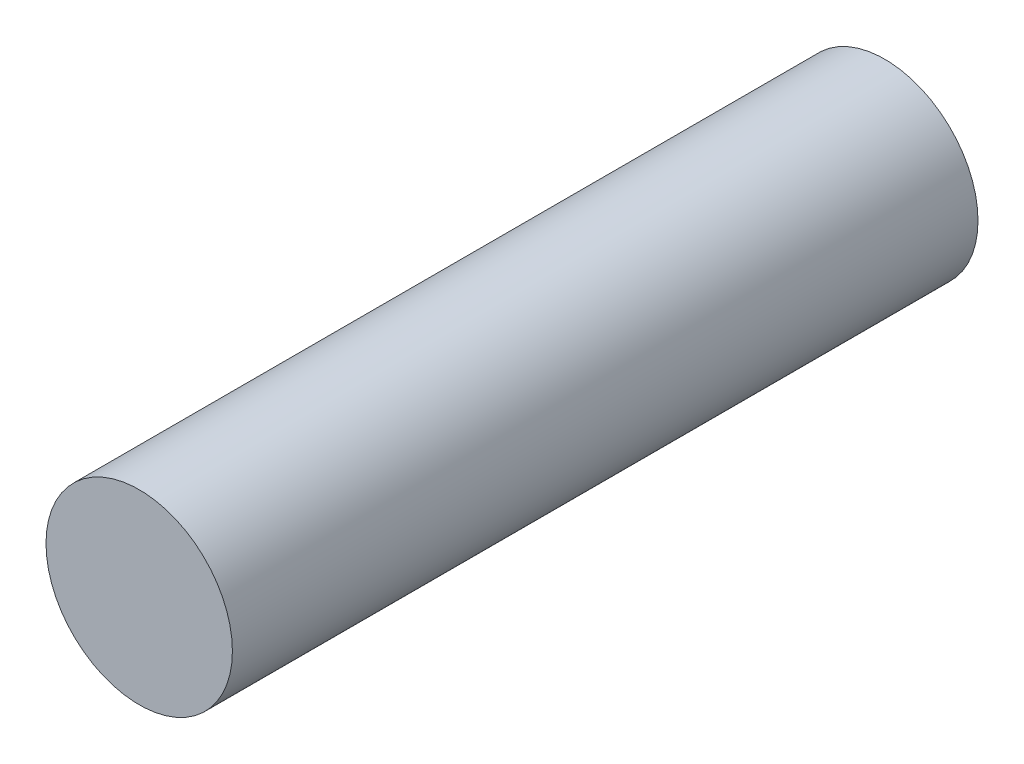
ISO-10303-21;
HEADER;
FILE_DESCRIPTION(('STEP AP214'),'2;1');
FILE_NAME('part.step','',(''),(''),'','','');
FILE_SCHEMA(('AUTOMOTIVE_DESIGN { 1 0 10303 214 1 1 1 1 }'));
ENDSEC;
DATA;
#1=APPLICATION_CONTEXT('core data for automotive mechanical design processes');
#2=APPLICATION_PROTOCOL_DEFINITION('international standard','automotive_design',2000,#1);
#3=PRODUCT_CONTEXT('',#1,'mechanical');
#4=PRODUCT('Part','Part','',(#3));
#5=PRODUCT_RELATED_PRODUCT_CATEGORY('part','',(#4));
#6=PRODUCT_DEFINITION_FORMATION('','',#4);
#7=PRODUCT_DEFINITION_CONTEXT('part definition',#1,'design');
#8=PRODUCT_DEFINITION('design','',#6,#7);
#9=PRODUCT_DEFINITION_SHAPE('','',#8);
#10=(LENGTH_UNIT() NAMED_UNIT(*) SI_UNIT(.MILLI.,.METRE.));
#11=(NAMED_UNIT(*) PLANE_ANGLE_UNIT() SI_UNIT($,.RADIAN.));
#12=(NAMED_UNIT(*) SI_UNIT($,.STERADIAN.) SOLID_ANGLE_UNIT());
#13=UNCERTAINTY_MEASURE_WITH_UNIT(LENGTH_MEASURE(1.E-05),#10,'distance_accuracy_value','');
#14=(GEOMETRIC_REPRESENTATION_CONTEXT(3) GLOBAL_UNCERTAINTY_ASSIGNED_CONTEXT((#13)) GLOBAL_UNIT_ASSIGNED_CONTEXT((#10,
#11,#12)) REPRESENTATION_CONTEXT('',''));
#15=CARTESIAN_POINT('',(0.,0.,0.));
#16=DIRECTION('',(0.,0.,1.));
#17=DIRECTION('',(1.,0.,0.));
#18=AXIS2_PLACEMENT_3D('',#15,#16,#17);
#19=CARTESIAN_POINT('',(0.,0.,101.6));
#20=DIRECTION('',(0.,0.,-1.));
#21=DIRECTION('',(-1.,0.,0.));
#22=AXIS2_PLACEMENT_3D('',#19,#20,#21);
#23=CYLINDRICAL_SURFACE('',#22,12.7);
#24=CARTESIAN_POINT('',(0.,0.,101.6));
#25=DIRECTION('',(0.,0.,1.));
#26=DIRECTION('',(1.,0.,0.));
#27=AXIS2_PLACEMENT_3D('',#24,#25,#26);
#28=CIRCLE('',#27,12.7);
#29=CARTESIAN_POINT('',(12.7,0.,101.6));
#30=VERTEX_POINT('',#29);
#31=EDGE_CURVE('E10',#30,#30,#28,.T.);
#32=ORIENTED_EDGE('',*,*,#31,.F.);
#33=EDGE_LOOP('',(#32));
#34=FACE_BOUND('',#33,.T.);
#35=CARTESIAN_POINT('',(0.,0.,0.));
#36=DIRECTION('',(0.,0.,1.));
#37=DIRECTION('',(1.,0.,0.));
#38=AXIS2_PLACEMENT_3D('',#35,#36,#37);
#39=CIRCLE('',#38,12.7);
#40=CARTESIAN_POINT('',(12.7,0.,0.));
#41=VERTEX_POINT('',#40);
#42=EDGE_CURVE('E39',#41,#41,#39,.T.);
#43=ORIENTED_EDGE('',*,*,#42,.T.);
#44=EDGE_LOOP('',(#43));
#45=FACE_BOUND('',#44,.T.);
#46=ADVANCED_FACE('F36',(#34,#45),#23,.T.);
#47=CARTESIAN_POINT('',(0.,0.,101.6));
#48=DIRECTION('',(0.,0.,1.));
#49=DIRECTION('',(1.,0.,0.));
#50=AXIS2_PLACEMENT_3D('',#47,#48,#49);
#51=PLANE('',#50);
#52=ORIENTED_EDGE('',*,*,#31,.T.);
#53=EDGE_LOOP('',(#52));
#54=FACE_BOUND('',#53,.T.);
#55=ADVANCED_FACE('F51',(#54),#51,.T.);
#56=CARTESIAN_POINT('',(0.,0.,0.));
#57=DIRECTION('',(0.,0.,1.));
#58=DIRECTION('',(1.,0.,0.));
#59=AXIS2_PLACEMENT_3D('',#56,#57,#58);
#60=PLANE('',#59);
#61=ORIENTED_EDGE('',*,*,#42,.F.);
#62=EDGE_LOOP('',(#61));
#63=FACE_BOUND('',#62,.T.);
#64=ADVANCED_FACE('F49',(#63),#60,.F.);
#65=CLOSED_SHELL('',(#46,#55,#64));
#66=MANIFOLD_SOLID_BREP('B2',#65);
#67=ADVANCED_BREP_SHAPE_REPRESENTATION('',(#18,#66),#14);
#68=SHAPE_DEFINITION_REPRESENTATION(#9,#67);
ENDSEC;
END-ISO-10303-21;
